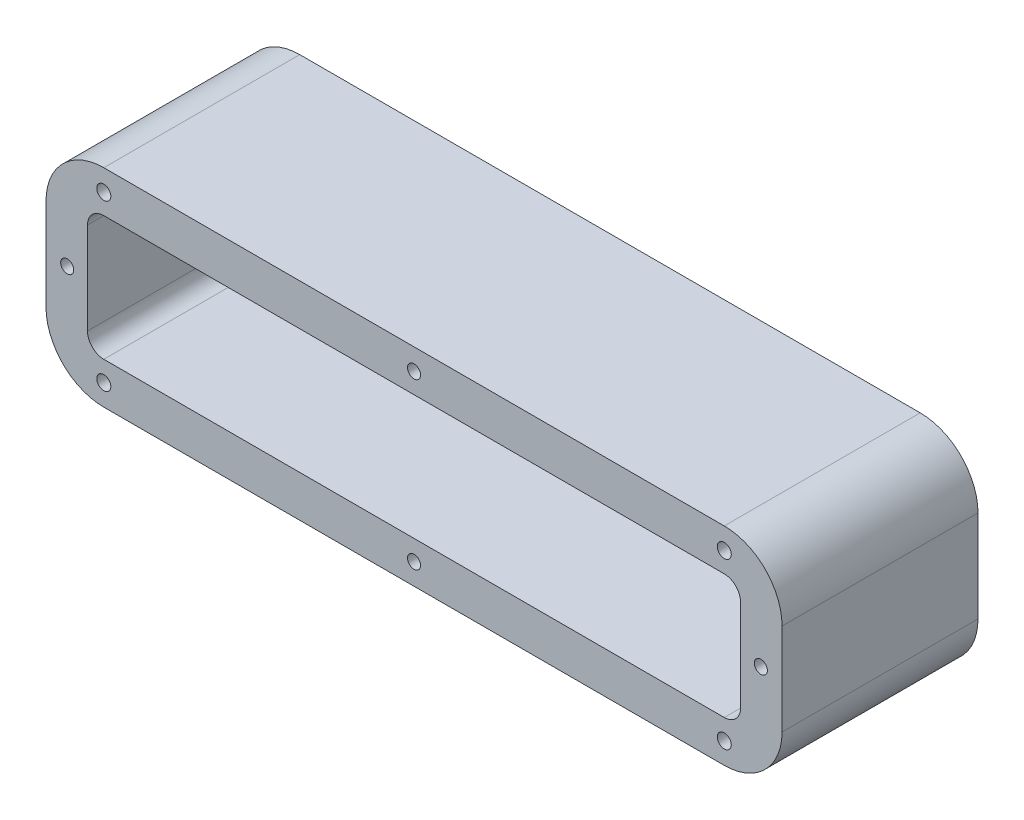
ISO-10303-21;
HEADER;
FILE_DESCRIPTION(('STEP AP214'),'2;1');
FILE_NAME('part.step','',(''),(''),'','','');
FILE_SCHEMA(('AUTOMOTIVE_DESIGN { 1 0 10303 214 1 1 1 1 }'));
ENDSEC;
DATA;
#1=APPLICATION_CONTEXT('core data for automotive mechanical design processes');
#2=APPLICATION_PROTOCOL_DEFINITION('international standard','automotive_design',2000,#1);
#3=PRODUCT_CONTEXT('',#1,'mechanical');
#4=PRODUCT('Part','Part','',(#3));
#5=PRODUCT_RELATED_PRODUCT_CATEGORY('part','',(#4));
#6=PRODUCT_DEFINITION_FORMATION('','',#4);
#7=PRODUCT_DEFINITION_CONTEXT('part definition',#1,'design');
#8=PRODUCT_DEFINITION('design','',#6,#7);
#9=PRODUCT_DEFINITION_SHAPE('','',#8);
#10=(LENGTH_UNIT() NAMED_UNIT(*) SI_UNIT(.MILLI.,.METRE.));
#11=(NAMED_UNIT(*) PLANE_ANGLE_UNIT() SI_UNIT($,.RADIAN.));
#12=(NAMED_UNIT(*) SI_UNIT($,.STERADIAN.) SOLID_ANGLE_UNIT());
#13=UNCERTAINTY_MEASURE_WITH_UNIT(LENGTH_MEASURE(1.E-05),#10,'distance_accuracy_value','');
#14=(GEOMETRIC_REPRESENTATION_CONTEXT(3) GLOBAL_UNCERTAINTY_ASSIGNED_CONTEXT((#13)) GLOBAL_UNIT_ASSIGNED_CONTEXT((#10,
#11,#12)) REPRESENTATION_CONTEXT('',''));
#15=CARTESIAN_POINT('',(0.,0.,0.));
#16=DIRECTION('',(0.,0.,1.));
#17=DIRECTION('',(1.,0.,0.));
#18=AXIS2_PLACEMENT_3D('',#15,#16,#17);
#19=CARTESIAN_POINT('',(95.,14.05,60.));
#20=DIRECTION('',(0.,0.,-1.));
#21=DIRECTION('',(-1.,0.,0.));
#22=AXIS2_PLACEMENT_3D('',#19,#20,#21);
#23=PLANE('',#22);
#24=CARTESIAN_POINT('',(95.,14.05,60.));
#25=DIRECTION('',(0.,0.,1.));
#26=DIRECTION('',(-1.,0.,0.));
#27=AXIS2_PLACEMENT_3D('',#24,#25,#26);
#28=CIRCLE('',#27,17.7);
#29=CARTESIAN_POINT('',(112.7,14.0499999999999,60.));
#30=VERTEX_POINT('',#29);
#31=CARTESIAN_POINT('',(94.9999999999999,31.75,60.));
#32=VERTEX_POINT('',#31);
#33=EDGE_CURVE('E218',#30,#32,#28,.T.);
#34=ORIENTED_EDGE('',*,*,#33,.T.);
#35=DIRECTION('',(-1.,0.,0.));
#36=VECTOR('',#35,1.);
#37=CARTESIAN_POINT('',(-94.9999999999999,31.75,60.));
#38=LINE('',#37,#36);
#39=CARTESIAN_POINT('',(-94.9999999999999,31.75,60.));
#40=VERTEX_POINT('',#39);
#41=EDGE_CURVE('E221',#32,#40,#38,.T.);
#42=ORIENTED_EDGE('',*,*,#41,.T.);
#43=CARTESIAN_POINT('',(-95.,14.05,60.));
#44=DIRECTION('',(0.,0.,1.));
#45=DIRECTION('',(-1.,0.,0.));
#46=AXIS2_PLACEMENT_3D('',#43,#44,#45);
#47=CIRCLE('',#46,17.7);
#48=CARTESIAN_POINT('',(-112.7,14.0499999999999,60.));
#49=VERTEX_POINT('',#48);
#50=EDGE_CURVE('E224',#40,#49,#47,.T.);
#51=ORIENTED_EDGE('',*,*,#50,.T.);
#52=DIRECTION('',(0.,-1.,0.));
#53=VECTOR('',#52,1.);
#54=CARTESIAN_POINT('',(-112.7,-14.0499999999999,60.));
#55=LINE('',#54,#53);
#56=CARTESIAN_POINT('',(-112.7,-14.0499999999999,60.));
#57=VERTEX_POINT('',#56);
#58=EDGE_CURVE('E226',#49,#57,#55,.T.);
#59=ORIENTED_EDGE('',*,*,#58,.T.);
#60=CARTESIAN_POINT('',(-95.,-14.05,60.));
#61=DIRECTION('',(0.,0.,1.));
#62=DIRECTION('',(-1.,0.,0.));
#63=AXIS2_PLACEMENT_3D('',#60,#61,#62);
#64=CIRCLE('',#63,17.7);
#65=CARTESIAN_POINT('',(-94.9999999999999,-31.75,60.));
#66=VERTEX_POINT('',#65);
#67=EDGE_CURVE('E228',#57,#66,#64,.T.);
#68=ORIENTED_EDGE('',*,*,#67,.T.);
#69=DIRECTION('',(1.,0.,0.));
#70=VECTOR('',#69,1.);
#71=CARTESIAN_POINT('',(-94.9999999999999,-31.75,60.));
#72=LINE('',#71,#70);
#73=CARTESIAN_POINT('',(94.9999999999999,-31.75,60.));
#74=VERTEX_POINT('',#73);
#75=EDGE_CURVE('E230',#66,#74,#72,.T.);
#76=ORIENTED_EDGE('',*,*,#75,.T.);
#77=CARTESIAN_POINT('',(95.,-14.05,60.));
#78=DIRECTION('',(0.,0.,1.));
#79=DIRECTION('',(1.,0.,0.));
#80=AXIS2_PLACEMENT_3D('',#77,#78,#79);
#81=CIRCLE('',#80,17.7);
#82=CARTESIAN_POINT('',(112.7,-14.05,60.));
#83=VERTEX_POINT('',#82);
#84=EDGE_CURVE('E232',#74,#83,#81,.T.);
#85=ORIENTED_EDGE('',*,*,#84,.T.);
#86=DIRECTION('',(0.,1.,0.));
#87=VECTOR('',#86,1.);
#88=CARTESIAN_POINT('',(112.7,-14.0499999999999,60.));
#89=LINE('',#88,#87);
#90=EDGE_CURVE('E234',#83,#30,#89,.T.);
#91=ORIENTED_EDGE('',*,*,#90,.T.);
#92=EDGE_LOOP('',(#34,#42,#51,#59,#68,#76,#85,#91));
#93=FACE_BOUND('',#92,.T.);
#94=CARTESIAN_POINT('',(95.0000000000001,14.05,60.));
#95=DIRECTION('',(0.,0.,1.));
#96=DIRECTION('',(-1.,0.,0.));
#97=AXIS2_PLACEMENT_3D('',#94,#95,#96);
#98=CIRCLE('',#97,5.);
#99=CARTESIAN_POINT('',(100.,14.05,60.));
#100=VERTEX_POINT('',#99);
#101=CARTESIAN_POINT('',(95.,19.05,60.));
#102=VERTEX_POINT('',#101);
#103=EDGE_CURVE('E150',#100,#102,#98,.T.);
#104=ORIENTED_EDGE('',*,*,#103,.F.);
#105=DIRECTION('',(0.,1.,0.));
#106=VECTOR('',#105,1.);
#107=CARTESIAN_POINT('',(100.,-14.05,60.));
#108=LINE('',#107,#106);
#109=CARTESIAN_POINT('',(100.,-14.05,60.));
#110=VERTEX_POINT('',#109);
#111=EDGE_CURVE('E185',#110,#100,#108,.T.);
#112=ORIENTED_EDGE('',*,*,#111,.F.);
#113=CARTESIAN_POINT('',(95.0000000000001,-14.05,60.));
#114=DIRECTION('',(0.,0.,1.));
#115=DIRECTION('',(1.,0.,0.));
#116=AXIS2_PLACEMENT_3D('',#113,#114,#115);
#117=CIRCLE('',#116,5.);
#118=CARTESIAN_POINT('',(95.,-19.05,60.));
#119=VERTEX_POINT('',#118);
#120=EDGE_CURVE('E183',#119,#110,#117,.T.);
#121=ORIENTED_EDGE('',*,*,#120,.F.);
#122=DIRECTION('',(1.,0.,0.));
#123=VECTOR('',#122,1.);
#124=CARTESIAN_POINT('',(-94.9999999999999,-19.05,60.));
#125=LINE('',#124,#123);
#126=CARTESIAN_POINT('',(-94.9999999999999,-19.05,60.));
#127=VERTEX_POINT('',#126);
#128=EDGE_CURVE('E181',#127,#119,#125,.T.);
#129=ORIENTED_EDGE('',*,*,#128,.F.);
#130=CARTESIAN_POINT('',(-94.9999999999999,-14.05,60.));
#131=DIRECTION('',(0.,0.,1.));
#132=DIRECTION('',(-1.,0.,0.));
#133=AXIS2_PLACEMENT_3D('',#130,#131,#132);
#134=CIRCLE('',#133,5.);
#135=CARTESIAN_POINT('',(-99.9999999999999,-14.05,60.));
#136=VERTEX_POINT('',#135);
#137=EDGE_CURVE('E179',#136,#127,#134,.T.);
#138=ORIENTED_EDGE('',*,*,#137,.F.);
#139=DIRECTION('',(0.,-1.,0.));
#140=VECTOR('',#139,1.);
#141=CARTESIAN_POINT('',(-99.9999999999999,-14.05,60.));
#142=LINE('',#141,#140);
#143=CARTESIAN_POINT('',(-99.9999999999999,14.05,60.));
#144=VERTEX_POINT('',#143);
#145=EDGE_CURVE('E174',#144,#136,#142,.T.);
#146=ORIENTED_EDGE('',*,*,#145,.F.);
#147=CARTESIAN_POINT('',(-94.9999999999999,14.05,60.));
#148=DIRECTION('',(0.,0.,1.));
#149=DIRECTION('',(-1.,0.,0.));
#150=AXIS2_PLACEMENT_3D('',#147,#148,#149);
#151=CIRCLE('',#150,5.);
#152=CARTESIAN_POINT('',(-94.9999999999999,19.05,60.));
#153=VERTEX_POINT('',#152);
#154=EDGE_CURVE('E172',#153,#144,#151,.T.);
#155=ORIENTED_EDGE('',*,*,#154,.F.);
#156=DIRECTION('',(-1.,0.,0.));
#157=VECTOR('',#156,1.);
#158=CARTESIAN_POINT('',(-94.9999999999999,19.05,60.));
#159=LINE('',#158,#157);
#160=EDGE_CURVE('E158',#102,#153,#159,.T.);
#161=ORIENTED_EDGE('',*,*,#160,.F.);
#162=EDGE_LOOP('',(#104,#112,#121,#129,#138,#146,#155,#161));
#163=FACE_BOUND('',#162,.T.);
#164=CARTESIAN_POINT('',(-106.2,0.,60.));
#165=DIRECTION('',(0.,0.,1.));
#166=DIRECTION('',(1.,0.,0.));
#167=AXIS2_PLACEMENT_3D('',#164,#165,#166);
#168=CIRCLE('',#167,2.);
#169=CARTESIAN_POINT('',(-104.2,0.,60.));
#170=VERTEX_POINT('',#169);
#171=EDGE_CURVE('E188',#170,#170,#168,.T.);
#172=ORIENTED_EDGE('',*,*,#171,.F.);
#173=EDGE_LOOP('',(#172));
#174=FACE_BOUND('',#173,.T.);
#175=CARTESIAN_POINT('',(0.,25.25,60.));
#176=DIRECTION('',(0.,0.,1.));
#177=DIRECTION('',(1.,0.,0.));
#178=AXIS2_PLACEMENT_3D('',#175,#176,#177);
#179=CIRCLE('',#178,2.);
#180=CARTESIAN_POINT('',(1.99999999999994,25.25,60.));
#181=VERTEX_POINT('',#180);
#182=EDGE_CURVE('E436',#181,#181,#179,.T.);
#183=ORIENTED_EDGE('',*,*,#182,.F.);
#184=EDGE_LOOP('',(#183));
#185=FACE_BOUND('',#184,.T.);
#186=CARTESIAN_POINT('',(-95.0000000000001,25.25,60.));
#187=DIRECTION('',(0.,0.,1.));
#188=DIRECTION('',(1.,0.,0.));
#189=AXIS2_PLACEMENT_3D('',#186,#187,#188);
#190=CIRCLE('',#189,2.14689788647293);
#191=CARTESIAN_POINT('',(-92.8531021135271,25.25,60.));
#192=VERTEX_POINT('',#191);
#193=EDGE_CURVE('E430',#192,#192,#190,.T.);
#194=ORIENTED_EDGE('',*,*,#193,.F.);
#195=EDGE_LOOP('',(#194));
#196=FACE_BOUND('',#195,.T.);
#197=CARTESIAN_POINT('',(-95.0000000000001,-25.25,60.));
#198=DIRECTION('',(0.,0.,1.));
#199=DIRECTION('',(-1.,0.,0.));
#200=AXIS2_PLACEMENT_3D('',#197,#198,#199);
#201=CIRCLE('',#200,2.14689788647293);
#202=CARTESIAN_POINT('',(-97.146897886473,-25.25,60.));
#203=VERTEX_POINT('',#202);
#204=EDGE_CURVE('E424',#203,#203,#201,.T.);
#205=ORIENTED_EDGE('',*,*,#204,.F.);
#206=EDGE_LOOP('',(#205));
#207=FACE_BOUND('',#206,.T.);
#208=CARTESIAN_POINT('',(0.,-25.25,60.));
#209=DIRECTION('',(0.,0.,1.));
#210=DIRECTION('',(-1.,0.,0.));
#211=AXIS2_PLACEMENT_3D('',#208,#209,#210);
#212=CIRCLE('',#211,2.);
#213=CARTESIAN_POINT('',(-2.00000000000007,-25.25,60.));
#214=VERTEX_POINT('',#213);
#215=EDGE_CURVE('E418',#214,#214,#212,.T.);
#216=ORIENTED_EDGE('',*,*,#215,.F.);
#217=EDGE_LOOP('',(#216));
#218=FACE_BOUND('',#217,.T.);
#219=CARTESIAN_POINT('',(94.9999999999999,-25.2500000000001,60.));
#220=DIRECTION('',(0.,0.,1.));
#221=DIRECTION('',(1.,0.,0.));
#222=AXIS2_PLACEMENT_3D('',#219,#220,#221);
#223=CIRCLE('',#222,2.14689788647293);
#224=CARTESIAN_POINT('',(97.1468978864728,-25.2500000000001,60.));
#225=VERTEX_POINT('',#224);
#226=EDGE_CURVE('E412',#225,#225,#223,.T.);
#227=ORIENTED_EDGE('',*,*,#226,.F.);
#228=EDGE_LOOP('',(#227));
#229=FACE_BOUND('',#228,.T.);
#230=CARTESIAN_POINT('',(106.2,0.,60.));
#231=DIRECTION('',(0.,0.,1.));
#232=DIRECTION('',(-1.,0.,0.));
#233=AXIS2_PLACEMENT_3D('',#230,#231,#232);
#234=CIRCLE('',#233,2.);
#235=CARTESIAN_POINT('',(104.2,0.,60.));
#236=VERTEX_POINT('',#235);
#237=EDGE_CURVE('E406',#236,#236,#234,.T.);
#238=ORIENTED_EDGE('',*,*,#237,.F.);
#239=EDGE_LOOP('',(#238));
#240=FACE_BOUND('',#239,.T.);
#241=CARTESIAN_POINT('',(95.,25.2499999999999,60.));
#242=DIRECTION('',(0.,0.,1.));
#243=DIRECTION('',(-1.,0.,0.));
#244=AXIS2_PLACEMENT_3D('',#241,#242,#243);
#245=CIRCLE('',#244,2.14689788647293);
#246=CARTESIAN_POINT('',(92.853102113527,25.2499999999999,60.));
#247=VERTEX_POINT('',#246);
#248=EDGE_CURVE('E397',#247,#247,#245,.T.);
#249=ORIENTED_EDGE('',*,*,#248,.F.);
#250=EDGE_LOOP('',(#249));
#251=FACE_BOUND('',#250,.T.);
#252=ADVANCED_FACE('F37',(#93,#163,#174,#185,#196,#207,#218,#229,#240,#251),#23,.F.);
#253=CARTESIAN_POINT('',(95.,14.05,0.));
#254=DIRECTION('',(0.,0.,-1.));
#255=DIRECTION('',(-1.,0.,0.));
#256=AXIS2_PLACEMENT_3D('',#253,#254,#255);
#257=PLANE('',#256);
#258=CARTESIAN_POINT('',(106.2,0.,0.));
#259=DIRECTION('',(0.,0.,1.));
#260=DIRECTION('',(-1.,0.,0.));
#261=AXIS2_PLACEMENT_3D('',#258,#259,#260);
#262=CIRCLE('',#261,2.);
#263=CARTESIAN_POINT('',(104.2,0.,0.));
#264=VERTEX_POINT('',#263);
#265=EDGE_CURVE('E403',#264,#264,#262,.T.);
#266=ORIENTED_EDGE('',*,*,#265,.T.);
#267=EDGE_LOOP('',(#266));
#268=FACE_BOUND('',#267,.T.);
#269=CARTESIAN_POINT('',(0.,-25.25,0.));
#270=DIRECTION('',(0.,0.,1.));
#271=DIRECTION('',(-1.,0.,0.));
#272=AXIS2_PLACEMENT_3D('',#269,#270,#271);
#273=CIRCLE('',#272,2.);
#274=CARTESIAN_POINT('',(-2.00000000000007,-25.25,0.));
#275=VERTEX_POINT('',#274);
#276=EDGE_CURVE('E415',#275,#275,#273,.T.);
#277=ORIENTED_EDGE('',*,*,#276,.T.);
#278=EDGE_LOOP('',(#277));
#279=FACE_BOUND('',#278,.T.);
#280=CARTESIAN_POINT('',(-95.0000000000001,25.25,0.));
#281=DIRECTION('',(0.,0.,1.));
#282=DIRECTION('',(1.,0.,0.));
#283=AXIS2_PLACEMENT_3D('',#280,#281,#282);
#284=CIRCLE('',#283,2.14689788647293);
#285=CARTESIAN_POINT('',(-92.8531021135271,25.25,0.));
#286=VERTEX_POINT('',#285);
#287=EDGE_CURVE('E427',#286,#286,#284,.T.);
#288=ORIENTED_EDGE('',*,*,#287,.T.);
#289=EDGE_LOOP('',(#288));
#290=FACE_BOUND('',#289,.T.);
#291=CARTESIAN_POINT('',(-106.2,0.,0.));
#292=DIRECTION('',(0.,0.,1.));
#293=DIRECTION('',(1.,0.,0.));
#294=AXIS2_PLACEMENT_3D('',#291,#292,#293);
#295=CIRCLE('',#294,2.);
#296=CARTESIAN_POINT('',(-104.2,0.,0.));
#297=VERTEX_POINT('',#296);
#298=EDGE_CURVE('E439',#297,#297,#295,.T.);
#299=ORIENTED_EDGE('',*,*,#298,.T.);
#300=EDGE_LOOP('',(#299));
#301=FACE_BOUND('',#300,.T.);
#302=CARTESIAN_POINT('',(95.,14.05,0.));
#303=DIRECTION('',(0.,0.,1.));
#304=DIRECTION('',(-1.,0.,0.));
#305=AXIS2_PLACEMENT_3D('',#302,#303,#304);
#306=CIRCLE('',#305,17.7);
#307=CARTESIAN_POINT('',(112.7,14.0499999999999,0.));
#308=VERTEX_POINT('',#307);
#309=CARTESIAN_POINT('',(94.9999999999999,31.75,0.));
#310=VERTEX_POINT('',#309);
#311=EDGE_CURVE('E166',#308,#310,#306,.T.);
#312=ORIENTED_EDGE('',*,*,#311,.F.);
#313=DIRECTION('',(0.,1.,0.));
#314=VECTOR('',#313,1.);
#315=CARTESIAN_POINT('',(112.7,-14.0499999999999,0.));
#316=LINE('',#315,#314);
#317=CARTESIAN_POINT('',(112.7,-14.05,0.));
#318=VERTEX_POINT('',#317);
#319=EDGE_CURVE('E222',#318,#308,#316,.T.);
#320=ORIENTED_EDGE('',*,*,#319,.F.);
#321=CARTESIAN_POINT('',(95.,-14.05,0.));
#322=DIRECTION('',(0.,0.,1.));
#323=DIRECTION('',(1.,0.,0.));
#324=AXIS2_PLACEMENT_3D('',#321,#322,#323);
#325=CIRCLE('',#324,17.7);
#326=CARTESIAN_POINT('',(94.9999999999999,-31.75,0.));
#327=VERTEX_POINT('',#326);
#328=EDGE_CURVE('E249',#327,#318,#325,.T.);
#329=ORIENTED_EDGE('',*,*,#328,.F.);
#330=DIRECTION('',(1.,0.,0.));
#331=VECTOR('',#330,1.);
#332=CARTESIAN_POINT('',(-94.9999999999999,-31.75,0.));
#333=LINE('',#332,#331);
#334=CARTESIAN_POINT('',(-94.9999999999999,-31.75,0.));
#335=VERTEX_POINT('',#334);
#336=EDGE_CURVE('E247',#335,#327,#333,.T.);
#337=ORIENTED_EDGE('',*,*,#336,.F.);
#338=CARTESIAN_POINT('',(-95.,-14.05,0.));
#339=DIRECTION('',(0.,0.,1.));
#340=DIRECTION('',(-1.,0.,0.));
#341=AXIS2_PLACEMENT_3D('',#338,#339,#340);
#342=CIRCLE('',#341,17.7);
#343=CARTESIAN_POINT('',(-112.7,-14.0499999999999,0.));
#344=VERTEX_POINT('',#343);
#345=EDGE_CURVE('E245',#344,#335,#342,.T.);
#346=ORIENTED_EDGE('',*,*,#345,.F.);
#347=DIRECTION('',(0.,-1.,0.));
#348=VECTOR('',#347,1.);
#349=CARTESIAN_POINT('',(-112.7,-14.0499999999999,0.));
#350=LINE('',#349,#348);
#351=CARTESIAN_POINT('',(-112.7,14.0499999999999,0.));
#352=VERTEX_POINT('',#351);
#353=EDGE_CURVE('E243',#352,#344,#350,.T.);
#354=ORIENTED_EDGE('',*,*,#353,.F.);
#355=CARTESIAN_POINT('',(-95.,14.05,0.));
#356=DIRECTION('',(0.,0.,1.));
#357=DIRECTION('',(-1.,0.,0.));
#358=AXIS2_PLACEMENT_3D('',#355,#356,#357);
#359=CIRCLE('',#358,17.7);
#360=CARTESIAN_POINT('',(-94.9999999999999,31.75,0.));
#361=VERTEX_POINT('',#360);
#362=EDGE_CURVE('E241',#361,#352,#359,.T.);
#363=ORIENTED_EDGE('',*,*,#362,.F.);
#364=DIRECTION('',(-1.,0.,0.));
#365=VECTOR('',#364,1.);
#366=CARTESIAN_POINT('',(-94.9999999999999,31.75,0.));
#367=LINE('',#366,#365);
#368=EDGE_CURVE('E239',#310,#361,#367,.T.);
#369=ORIENTED_EDGE('',*,*,#368,.F.);
#370=EDGE_LOOP('',(#312,#320,#329,#337,#346,#354,#363,#369));
#371=FACE_BOUND('',#370,.T.);
#372=DIRECTION('',(0.,1.,0.));
#373=VECTOR('',#372,1.);
#374=CARTESIAN_POINT('',(100.,-14.05,0.));
#375=LINE('',#374,#373);
#376=CARTESIAN_POINT('',(100.,-14.05,0.));
#377=VERTEX_POINT('',#376);
#378=CARTESIAN_POINT('',(100.,14.05,0.));
#379=VERTEX_POINT('',#378);
#380=EDGE_CURVE('E159',#377,#379,#375,.T.);
#381=ORIENTED_EDGE('',*,*,#380,.T.);
#382=CARTESIAN_POINT('',(95.0000000000001,14.05,0.));
#383=DIRECTION('',(0.,0.,1.));
#384=DIRECTION('',(-1.,0.,0.));
#385=AXIS2_PLACEMENT_3D('',#382,#383,#384);
#386=CIRCLE('',#385,5.);
#387=CARTESIAN_POINT('',(95.,19.05,0.));
#388=VERTEX_POINT('',#387);
#389=EDGE_CURVE('E60',#379,#388,#386,.T.);
#390=ORIENTED_EDGE('',*,*,#389,.T.);
#391=DIRECTION('',(-1.,0.,0.));
#392=VECTOR('',#391,1.);
#393=CARTESIAN_POINT('',(-94.9999999999999,19.05,0.));
#394=LINE('',#393,#392);
#395=CARTESIAN_POINT('',(-94.9999999999999,19.05,0.));
#396=VERTEX_POINT('',#395);
#397=EDGE_CURVE('E165',#388,#396,#394,.T.);
#398=ORIENTED_EDGE('',*,*,#397,.T.);
#399=CARTESIAN_POINT('',(-94.9999999999999,14.05,0.));
#400=DIRECTION('',(0.,0.,1.));
#401=DIRECTION('',(-1.,0.,0.));
#402=AXIS2_PLACEMENT_3D('',#399,#400,#401);
#403=CIRCLE('',#402,5.);
#404=CARTESIAN_POINT('',(-99.9999999999999,14.05,0.));
#405=VERTEX_POINT('',#404);
#406=EDGE_CURVE('E190',#396,#405,#403,.T.);
#407=ORIENTED_EDGE('',*,*,#406,.T.);
#408=DIRECTION('',(0.,-1.,0.));
#409=VECTOR('',#408,1.);
#410=CARTESIAN_POINT('',(-99.9999999999999,-14.05,0.));
#411=LINE('',#410,#409);
#412=CARTESIAN_POINT('',(-99.9999999999999,-14.05,0.));
#413=VERTEX_POINT('',#412);
#414=EDGE_CURVE('E193',#405,#413,#411,.T.);
#415=ORIENTED_EDGE('',*,*,#414,.T.);
#416=CARTESIAN_POINT('',(-94.9999999999999,-14.05,0.));
#417=DIRECTION('',(0.,0.,1.));
#418=DIRECTION('',(-1.,0.,0.));
#419=AXIS2_PLACEMENT_3D('',#416,#417,#418);
#420=CIRCLE('',#419,5.);
#421=CARTESIAN_POINT('',(-94.9999999999999,-19.05,0.));
#422=VERTEX_POINT('',#421);
#423=EDGE_CURVE('E196',#413,#422,#420,.T.);
#424=ORIENTED_EDGE('',*,*,#423,.T.);
#425=DIRECTION('',(1.,0.,0.));
#426=VECTOR('',#425,1.);
#427=CARTESIAN_POINT('',(-94.9999999999999,-19.05,0.));
#428=LINE('',#427,#426);
#429=CARTESIAN_POINT('',(95.,-19.05,0.));
#430=VERTEX_POINT('',#429);
#431=EDGE_CURVE('E199',#422,#430,#428,.T.);
#432=ORIENTED_EDGE('',*,*,#431,.T.);
#433=CARTESIAN_POINT('',(95.0000000000001,-14.05,0.));
#434=DIRECTION('',(0.,0.,1.));
#435=DIRECTION('',(1.,0.,0.));
#436=AXIS2_PLACEMENT_3D('',#433,#434,#435);
#437=CIRCLE('',#436,5.);
#438=EDGE_CURVE('E202',#430,#377,#437,.T.);
#439=ORIENTED_EDGE('',*,*,#438,.T.);
#440=EDGE_LOOP('',(#381,#390,#398,#407,#415,#424,#432,#439));
#441=FACE_BOUND('',#440,.T.);
#442=CARTESIAN_POINT('',(0.,25.25,0.));
#443=DIRECTION('',(0.,0.,1.));
#444=DIRECTION('',(1.,0.,0.));
#445=AXIS2_PLACEMENT_3D('',#442,#443,#444);
#446=CIRCLE('',#445,2.);
#447=CARTESIAN_POINT('',(1.99999999999994,25.25,0.));
#448=VERTEX_POINT('',#447);
#449=EDGE_CURVE('E433',#448,#448,#446,.T.);
#450=ORIENTED_EDGE('',*,*,#449,.T.);
#451=EDGE_LOOP('',(#450));
#452=FACE_BOUND('',#451,.T.);
#453=CARTESIAN_POINT('',(-95.0000000000001,-25.25,0.));
#454=DIRECTION('',(0.,0.,1.));
#455=DIRECTION('',(-1.,0.,0.));
#456=AXIS2_PLACEMENT_3D('',#453,#454,#455);
#457=CIRCLE('',#456,2.14689788647293);
#458=CARTESIAN_POINT('',(-97.146897886473,-25.25,0.));
#459=VERTEX_POINT('',#458);
#460=EDGE_CURVE('E421',#459,#459,#457,.T.);
#461=ORIENTED_EDGE('',*,*,#460,.T.);
#462=EDGE_LOOP('',(#461));
#463=FACE_BOUND('',#462,.T.);
#464=CARTESIAN_POINT('',(94.9999999999999,-25.2500000000001,0.));
#465=DIRECTION('',(0.,0.,1.));
#466=DIRECTION('',(1.,0.,0.));
#467=AXIS2_PLACEMENT_3D('',#464,#465,#466);
#468=CIRCLE('',#467,2.14689788647293);
#469=CARTESIAN_POINT('',(97.1468978864728,-25.2500000000001,0.));
#470=VERTEX_POINT('',#469);
#471=EDGE_CURVE('E409',#470,#470,#468,.T.);
#472=ORIENTED_EDGE('',*,*,#471,.T.);
#473=EDGE_LOOP('',(#472));
#474=FACE_BOUND('',#473,.T.);
#475=CARTESIAN_POINT('',(95.,25.2499999999999,0.));
#476=DIRECTION('',(0.,0.,1.));
#477=DIRECTION('',(-1.,0.,0.));
#478=AXIS2_PLACEMENT_3D('',#475,#476,#477);
#479=CIRCLE('',#478,2.14689788647293);
#480=CARTESIAN_POINT('',(92.853102113527,25.2499999999999,0.));
#481=VERTEX_POINT('',#480);
#482=EDGE_CURVE('E400',#481,#481,#479,.T.);
#483=ORIENTED_EDGE('',*,*,#482,.T.);
#484=EDGE_LOOP('',(#483));
#485=FACE_BOUND('',#484,.T.);
#486=ADVANCED_FACE('F279',(#268,#279,#290,#301,#371,#441,#452,#463,#474,#485),#257,.T.);
#487=CARTESIAN_POINT('',(95.,14.05,60.));
#488=DIRECTION('',(0.,0.,-1.));
#489=DIRECTION('',(-1.,0.,0.));
#490=AXIS2_PLACEMENT_3D('',#487,#488,#489);
#491=CYLINDRICAL_SURFACE('',#490,17.7);
#492=ORIENTED_EDGE('',*,*,#311,.T.);
#493=DIRECTION('',(0.,0.,-1.));
#494=VECTOR('',#493,1.);
#495=CARTESIAN_POINT('',(94.9999999999999,31.75,60.));
#496=LINE('',#495,#494);
#497=EDGE_CURVE('E11',#32,#310,#496,.T.);
#498=ORIENTED_EDGE('',*,*,#497,.F.);
#499=ORIENTED_EDGE('',*,*,#33,.F.);
#500=DIRECTION('',(0.,0.,-1.));
#501=VECTOR('',#500,1.);
#502=CARTESIAN_POINT('',(112.7,14.0499999999999,60.));
#503=LINE('',#502,#501);
#504=EDGE_CURVE('E236',#30,#308,#503,.T.);
#505=ORIENTED_EDGE('',*,*,#504,.T.);
#506=EDGE_LOOP('',(#492,#498,#499,#505));
#507=FACE_BOUND('',#506,.T.);
#508=ADVANCED_FACE('F39',(#507),#491,.T.);
#509=CARTESIAN_POINT('',(-94.9999999999999,31.75,60.));
#510=DIRECTION('',(0.,-1.,0.));
#511=DIRECTION('',(0.,0.,-1.));
#512=AXIS2_PLACEMENT_3D('',#509,#510,#511);
#513=PLANE('',#512);
#514=ORIENTED_EDGE('',*,*,#368,.T.);
#515=DIRECTION('',(0.,0.,-1.));
#516=VECTOR('',#515,1.);
#517=CARTESIAN_POINT('',(-94.9999999999999,31.75,60.));
#518=LINE('',#517,#516);
#519=EDGE_CURVE('E45',#40,#361,#518,.T.);
#520=ORIENTED_EDGE('',*,*,#519,.F.);
#521=ORIENTED_EDGE('',*,*,#41,.F.);
#522=ORIENTED_EDGE('',*,*,#497,.T.);
#523=EDGE_LOOP('',(#514,#520,#521,#522));
#524=FACE_BOUND('',#523,.T.);
#525=ADVANCED_FACE('F296',(#524),#513,.F.);
#526=CARTESIAN_POINT('',(-95.,14.05,60.));
#527=DIRECTION('',(0.,0.,-1.));
#528=DIRECTION('',(-1.,0.,0.));
#529=AXIS2_PLACEMENT_3D('',#526,#527,#528);
#530=CYLINDRICAL_SURFACE('',#529,17.7);
#531=ORIENTED_EDGE('',*,*,#362,.T.);
#532=DIRECTION('',(0.,0.,-1.));
#533=VECTOR('',#532,1.);
#534=CARTESIAN_POINT('',(-112.7,14.0499999999999,60.));
#535=LINE('',#534,#533);
#536=EDGE_CURVE('E266',#49,#352,#535,.T.);
#537=ORIENTED_EDGE('',*,*,#536,.F.);
#538=ORIENTED_EDGE('',*,*,#50,.F.);
#539=ORIENTED_EDGE('',*,*,#519,.T.);
#540=EDGE_LOOP('',(#531,#537,#538,#539));
#541=FACE_BOUND('',#540,.T.);
#542=ADVANCED_FACE('F273',(#541),#530,.T.);
#543=CARTESIAN_POINT('',(-112.7,-14.0499999999999,60.));
#544=DIRECTION('',(1.,0.,0.));
#545=DIRECTION('',(0.,0.,-1.));
#546=AXIS2_PLACEMENT_3D('',#543,#544,#545);
#547=PLANE('',#546);
#548=ORIENTED_EDGE('',*,*,#353,.T.);
#549=DIRECTION('',(0.,0.,-1.));
#550=VECTOR('',#549,1.);
#551=CARTESIAN_POINT('',(-112.7,-14.0499999999999,60.));
#552=LINE('',#551,#550);
#553=EDGE_CURVE('E263',#57,#344,#552,.T.);
#554=ORIENTED_EDGE('',*,*,#553,.F.);
#555=ORIENTED_EDGE('',*,*,#58,.F.);
#556=ORIENTED_EDGE('',*,*,#536,.T.);
#557=EDGE_LOOP('',(#548,#554,#555,#556));
#558=FACE_BOUND('',#557,.T.);
#559=ADVANCED_FACE('F285',(#558),#547,.F.);
#560=CARTESIAN_POINT('',(-95.,-14.05,60.));
#561=DIRECTION('',(0.,0.,-1.));
#562=DIRECTION('',(-1.,0.,0.));
#563=AXIS2_PLACEMENT_3D('',#560,#561,#562);
#564=CYLINDRICAL_SURFACE('',#563,17.7);
#565=ORIENTED_EDGE('',*,*,#345,.T.);
#566=DIRECTION('',(0.,0.,-1.));
#567=VECTOR('',#566,1.);
#568=CARTESIAN_POINT('',(-94.9999999999999,-31.75,60.));
#569=LINE('',#568,#567);
#570=EDGE_CURVE('E260',#66,#335,#569,.T.);
#571=ORIENTED_EDGE('',*,*,#570,.F.);
#572=ORIENTED_EDGE('',*,*,#67,.F.);
#573=ORIENTED_EDGE('',*,*,#553,.T.);
#574=EDGE_LOOP('',(#565,#571,#572,#573));
#575=FACE_BOUND('',#574,.T.);
#576=ADVANCED_FACE('F289',(#575),#564,.T.);
#577=CARTESIAN_POINT('',(-94.9999999999999,-31.75,60.));
#578=DIRECTION('',(0.,1.,0.));
#579=DIRECTION('',(0.,0.,1.));
#580=AXIS2_PLACEMENT_3D('',#577,#578,#579);
#581=PLANE('',#580);
#582=ORIENTED_EDGE('',*,*,#336,.T.);
#583=DIRECTION('',(0.,0.,-1.));
#584=VECTOR('',#583,1.);
#585=CARTESIAN_POINT('',(94.9999999999999,-31.75,60.));
#586=LINE('',#585,#584);
#587=EDGE_CURVE('E257',#74,#327,#586,.T.);
#588=ORIENTED_EDGE('',*,*,#587,.F.);
#589=ORIENTED_EDGE('',*,*,#75,.F.);
#590=ORIENTED_EDGE('',*,*,#570,.T.);
#591=EDGE_LOOP('',(#582,#588,#589,#590));
#592=FACE_BOUND('',#591,.T.);
#593=ADVANCED_FACE('F309',(#592),#581,.F.);
#594=CARTESIAN_POINT('',(95.,-14.05,60.));
#595=DIRECTION('',(0.,0.,-1.));
#596=DIRECTION('',(-1.,0.,0.));
#597=AXIS2_PLACEMENT_3D('',#594,#595,#596);
#598=CYLINDRICAL_SURFACE('',#597,17.7);
#599=ORIENTED_EDGE('',*,*,#328,.T.);
#600=DIRECTION('',(0.,0.,-1.));
#601=VECTOR('',#600,1.);
#602=CARTESIAN_POINT('',(112.7,-14.05,60.));
#603=LINE('',#602,#601);
#604=EDGE_CURVE('E254',#83,#318,#603,.T.);
#605=ORIENTED_EDGE('',*,*,#604,.F.);
#606=ORIENTED_EDGE('',*,*,#84,.F.);
#607=ORIENTED_EDGE('',*,*,#587,.T.);
#608=EDGE_LOOP('',(#599,#605,#606,#607));
#609=FACE_BOUND('',#608,.T.);
#610=ADVANCED_FACE('F307',(#609),#598,.T.);
#611=CARTESIAN_POINT('',(112.7,-14.0499999999999,60.));
#612=DIRECTION('',(-1.,0.,0.));
#613=DIRECTION('',(0.,0.,1.));
#614=AXIS2_PLACEMENT_3D('',#611,#612,#613);
#615=PLANE('',#614);
#616=ORIENTED_EDGE('',*,*,#319,.T.);
#617=ORIENTED_EDGE('',*,*,#504,.F.);
#618=ORIENTED_EDGE('',*,*,#90,.F.);
#619=ORIENTED_EDGE('',*,*,#604,.T.);
#620=EDGE_LOOP('',(#616,#617,#618,#619));
#621=FACE_BOUND('',#620,.T.);
#622=ADVANCED_FACE('F302',(#621),#615,.F.);
#623=CARTESIAN_POINT('',(95.0000000000001,14.05,60.));
#624=DIRECTION('',(0.,0.,-1.));
#625=DIRECTION('',(-1.,0.,0.));
#626=AXIS2_PLACEMENT_3D('',#623,#624,#625);
#627=CYLINDRICAL_SURFACE('',#626,5.);
#628=ORIENTED_EDGE('',*,*,#389,.F.);
#629=DIRECTION('',(0.,0.,-1.));
#630=VECTOR('',#629,1.);
#631=CARTESIAN_POINT('',(100.,14.05,60.));
#632=LINE('',#631,#630);
#633=EDGE_CURVE('E154',#100,#379,#632,.T.);
#634=ORIENTED_EDGE('',*,*,#633,.F.);
#635=ORIENTED_EDGE('',*,*,#103,.T.);
#636=DIRECTION('',(0.,0.,-1.));
#637=VECTOR('',#636,1.);
#638=CARTESIAN_POINT('',(95.,19.05,60.));
#639=LINE('',#638,#637);
#640=EDGE_CURVE('E153',#102,#388,#639,.T.);
#641=ORIENTED_EDGE('',*,*,#640,.T.);
#642=EDGE_LOOP('',(#628,#634,#635,#641));
#643=FACE_BOUND('',#642,.T.);
#644=ADVANCED_FACE('F152',(#643),#627,.F.);
#645=CARTESIAN_POINT('',(-94.9999999999999,19.05,60.));
#646=DIRECTION('',(0.,-1.,0.));
#647=DIRECTION('',(0.,0.,-1.));
#648=AXIS2_PLACEMENT_3D('',#645,#646,#647);
#649=PLANE('',#648);
#650=ORIENTED_EDGE('',*,*,#397,.F.);
#651=ORIENTED_EDGE('',*,*,#640,.F.);
#652=ORIENTED_EDGE('',*,*,#160,.T.);
#653=DIRECTION('',(0.,0.,-1.));
#654=VECTOR('',#653,1.);
#655=CARTESIAN_POINT('',(-94.9999999999999,19.05,60.));
#656=LINE('',#655,#654);
#657=EDGE_CURVE('E167',#153,#396,#656,.T.);
#658=ORIENTED_EDGE('',*,*,#657,.T.);
#659=EDGE_LOOP('',(#650,#651,#652,#658));
#660=FACE_BOUND('',#659,.T.);
#661=ADVANCED_FACE('F162',(#660),#649,.T.);
#662=CARTESIAN_POINT('',(-94.9999999999999,14.05,60.));
#663=DIRECTION('',(0.,0.,-1.));
#664=DIRECTION('',(-1.,0.,0.));
#665=AXIS2_PLACEMENT_3D('',#662,#663,#664);
#666=CYLINDRICAL_SURFACE('',#665,5.);
#667=ORIENTED_EDGE('',*,*,#406,.F.);
#668=ORIENTED_EDGE('',*,*,#657,.F.);
#669=ORIENTED_EDGE('',*,*,#154,.T.);
#670=DIRECTION('',(0.,0.,-1.));
#671=VECTOR('',#670,1.);
#672=CARTESIAN_POINT('',(-99.9999999999999,14.05,60.));
#673=LINE('',#672,#671);
#674=EDGE_CURVE('E215',#144,#405,#673,.T.);
#675=ORIENTED_EDGE('',*,*,#674,.T.);
#676=EDGE_LOOP('',(#667,#668,#669,#675));
#677=FACE_BOUND('',#676,.T.);
#678=ADVANCED_FACE('F335',(#677),#666,.F.);
#679=CARTESIAN_POINT('',(-99.9999999999999,-14.05,60.));
#680=DIRECTION('',(1.,0.,0.));
#681=DIRECTION('',(0.,0.,-1.));
#682=AXIS2_PLACEMENT_3D('',#679,#680,#681);
#683=PLANE('',#682);
#684=ORIENTED_EDGE('',*,*,#414,.F.);
#685=ORIENTED_EDGE('',*,*,#674,.F.);
#686=ORIENTED_EDGE('',*,*,#145,.T.);
#687=DIRECTION('',(0.,0.,-1.));
#688=VECTOR('',#687,1.);
#689=CARTESIAN_POINT('',(-99.9999999999999,-14.05,60.));
#690=LINE('',#689,#688);
#691=EDGE_CURVE('E213',#136,#413,#690,.T.);
#692=ORIENTED_EDGE('',*,*,#691,.T.);
#693=EDGE_LOOP('',(#684,#685,#686,#692));
#694=FACE_BOUND('',#693,.T.);
#695=ADVANCED_FACE('F339',(#694),#683,.T.);
#696=CARTESIAN_POINT('',(-94.9999999999999,-14.05,60.));
#697=DIRECTION('',(0.,0.,-1.));
#698=DIRECTION('',(-1.,0.,0.));
#699=AXIS2_PLACEMENT_3D('',#696,#697,#698);
#700=CYLINDRICAL_SURFACE('',#699,5.);
#701=ORIENTED_EDGE('',*,*,#423,.F.);
#702=ORIENTED_EDGE('',*,*,#691,.F.);
#703=ORIENTED_EDGE('',*,*,#137,.T.);
#704=DIRECTION('',(0.,0.,-1.));
#705=VECTOR('',#704,1.);
#706=CARTESIAN_POINT('',(-94.9999999999999,-19.05,60.));
#707=LINE('',#706,#705);
#708=EDGE_CURVE('E211',#127,#422,#707,.T.);
#709=ORIENTED_EDGE('',*,*,#708,.T.);
#710=EDGE_LOOP('',(#701,#702,#703,#709));
#711=FACE_BOUND('',#710,.T.);
#712=ADVANCED_FACE('F345',(#711),#700,.F.);
#713=CARTESIAN_POINT('',(-94.9999999999999,-19.05,60.));
#714=DIRECTION('',(0.,1.,0.));
#715=DIRECTION('',(0.,0.,1.));
#716=AXIS2_PLACEMENT_3D('',#713,#714,#715);
#717=PLANE('',#716);
#718=ORIENTED_EDGE('',*,*,#431,.F.);
#719=ORIENTED_EDGE('',*,*,#708,.F.);
#720=ORIENTED_EDGE('',*,*,#128,.T.);
#721=DIRECTION('',(0.,0.,-1.));
#722=VECTOR('',#721,1.);
#723=CARTESIAN_POINT('',(95.,-19.05,60.));
#724=LINE('',#723,#722);
#725=EDGE_CURVE('E209',#119,#430,#724,.T.);
#726=ORIENTED_EDGE('',*,*,#725,.T.);
#727=EDGE_LOOP('',(#718,#719,#720,#726));
#728=FACE_BOUND('',#727,.T.);
#729=ADVANCED_FACE('F349',(#728),#717,.T.);
#730=CARTESIAN_POINT('',(95.0000000000001,-14.05,60.));
#731=DIRECTION('',(0.,0.,-1.));
#732=DIRECTION('',(-1.,0.,0.));
#733=AXIS2_PLACEMENT_3D('',#730,#731,#732);
#734=CYLINDRICAL_SURFACE('',#733,5.);
#735=ORIENTED_EDGE('',*,*,#438,.F.);
#736=ORIENTED_EDGE('',*,*,#725,.F.);
#737=ORIENTED_EDGE('',*,*,#120,.T.);
#738=DIRECTION('',(0.,0.,-1.));
#739=VECTOR('',#738,1.);
#740=CARTESIAN_POINT('',(100.,-14.05,60.));
#741=LINE('',#740,#739);
#742=EDGE_CURVE('E52',#110,#377,#741,.T.);
#743=ORIENTED_EDGE('',*,*,#742,.T.);
#744=EDGE_LOOP('',(#735,#736,#737,#743));
#745=FACE_BOUND('',#744,.T.);
#746=ADVANCED_FACE('F353',(#745),#734,.F.);
#747=CARTESIAN_POINT('',(100.,-14.05,60.));
#748=DIRECTION('',(-1.,0.,0.));
#749=DIRECTION('',(0.,0.,1.));
#750=AXIS2_PLACEMENT_3D('',#747,#748,#749);
#751=PLANE('',#750);
#752=ORIENTED_EDGE('',*,*,#380,.F.);
#753=ORIENTED_EDGE('',*,*,#742,.F.);
#754=ORIENTED_EDGE('',*,*,#111,.T.);
#755=ORIENTED_EDGE('',*,*,#633,.T.);
#756=EDGE_LOOP('',(#752,#753,#754,#755));
#757=FACE_BOUND('',#756,.T.);
#758=ADVANCED_FACE('F357',(#757),#751,.T.);
#759=CARTESIAN_POINT('',(-106.2,0.,60.));
#760=DIRECTION('',(0.,0.,-1.));
#761=DIRECTION('',(-1.,0.,0.));
#762=AXIS2_PLACEMENT_3D('',#759,#760,#761);
#763=CYLINDRICAL_SURFACE('',#762,2.);
#764=ORIENTED_EDGE('',*,*,#171,.T.);
#765=EDGE_LOOP('',(#764));
#766=FACE_BOUND('',#765,.T.);
#767=ORIENTED_EDGE('',*,*,#298,.F.);
#768=EDGE_LOOP('',(#767));
#769=FACE_BOUND('',#768,.T.);
#770=ADVANCED_FACE('F361',(#766,#769),#763,.F.);
#771=CARTESIAN_POINT('',(0.,25.25,60.));
#772=DIRECTION('',(0.,0.,-1.));
#773=DIRECTION('',(-1.,0.,0.));
#774=AXIS2_PLACEMENT_3D('',#771,#772,#773);
#775=CYLINDRICAL_SURFACE('',#774,2.);
#776=ORIENTED_EDGE('',*,*,#182,.T.);
#777=EDGE_LOOP('',(#776));
#778=FACE_BOUND('',#777,.T.);
#779=ORIENTED_EDGE('',*,*,#449,.F.);
#780=EDGE_LOOP('',(#779));
#781=FACE_BOUND('',#780,.T.);
#782=ADVANCED_FACE('F364',(#778,#781),#775,.F.);
#783=CARTESIAN_POINT('',(-95.0000000000001,25.25,60.));
#784=DIRECTION('',(0.,0.,-1.));
#785=DIRECTION('',(-1.,0.,0.));
#786=AXIS2_PLACEMENT_3D('',#783,#784,#785);
#787=CYLINDRICAL_SURFACE('',#786,2.14689788647293);
#788=ORIENTED_EDGE('',*,*,#193,.T.);
#789=EDGE_LOOP('',(#788));
#790=FACE_BOUND('',#789,.T.);
#791=ORIENTED_EDGE('',*,*,#287,.F.);
#792=EDGE_LOOP('',(#791));
#793=FACE_BOUND('',#792,.T.);
#794=ADVANCED_FACE('F368',(#790,#793),#787,.F.);
#795=CARTESIAN_POINT('',(-95.0000000000001,-25.25,60.));
#796=DIRECTION('',(0.,0.,-1.));
#797=DIRECTION('',(-1.,0.,0.));
#798=AXIS2_PLACEMENT_3D('',#795,#796,#797);
#799=CYLINDRICAL_SURFACE('',#798,2.14689788647293);
#800=ORIENTED_EDGE('',*,*,#204,.T.);
#801=EDGE_LOOP('',(#800));
#802=FACE_BOUND('',#801,.T.);
#803=ORIENTED_EDGE('',*,*,#460,.F.);
#804=EDGE_LOOP('',(#803));
#805=FACE_BOUND('',#804,.T.);
#806=ADVANCED_FACE('F372',(#802,#805),#799,.F.);
#807=CARTESIAN_POINT('',(0.,-25.25,60.));
#808=DIRECTION('',(0.,0.,-1.));
#809=DIRECTION('',(-1.,0.,0.));
#810=AXIS2_PLACEMENT_3D('',#807,#808,#809);
#811=CYLINDRICAL_SURFACE('',#810,2.);
#812=ORIENTED_EDGE('',*,*,#215,.T.);
#813=EDGE_LOOP('',(#812));
#814=FACE_BOUND('',#813,.T.);
#815=ORIENTED_EDGE('',*,*,#276,.F.);
#816=EDGE_LOOP('',(#815));
#817=FACE_BOUND('',#816,.T.);
#818=ADVANCED_FACE('F376',(#814,#817),#811,.F.);
#819=CARTESIAN_POINT('',(94.9999999999999,-25.2500000000001,60.));
#820=DIRECTION('',(0.,0.,-1.));
#821=DIRECTION('',(-1.,0.,0.));
#822=AXIS2_PLACEMENT_3D('',#819,#820,#821);
#823=CYLINDRICAL_SURFACE('',#822,2.14689788647293);
#824=ORIENTED_EDGE('',*,*,#226,.T.);
#825=EDGE_LOOP('',(#824));
#826=FACE_BOUND('',#825,.T.);
#827=ORIENTED_EDGE('',*,*,#471,.F.);
#828=EDGE_LOOP('',(#827));
#829=FACE_BOUND('',#828,.T.);
#830=ADVANCED_FACE('F380',(#826,#829),#823,.F.);
#831=CARTESIAN_POINT('',(106.2,0.,60.));
#832=DIRECTION('',(0.,0.,-1.));
#833=DIRECTION('',(-1.,0.,0.));
#834=AXIS2_PLACEMENT_3D('',#831,#832,#833);
#835=CYLINDRICAL_SURFACE('',#834,2.);
#836=ORIENTED_EDGE('',*,*,#237,.T.);
#837=EDGE_LOOP('',(#836));
#838=FACE_BOUND('',#837,.T.);
#839=ORIENTED_EDGE('',*,*,#265,.F.);
#840=EDGE_LOOP('',(#839));
#841=FACE_BOUND('',#840,.T.);
#842=ADVANCED_FACE('F384',(#838,#841),#835,.F.);
#843=CARTESIAN_POINT('',(95.,25.2499999999999,60.));
#844=DIRECTION('',(0.,0.,-1.));
#845=DIRECTION('',(-1.,0.,0.));
#846=AXIS2_PLACEMENT_3D('',#843,#844,#845);
#847=CYLINDRICAL_SURFACE('',#846,2.14689788647293);
#848=ORIENTED_EDGE('',*,*,#248,.T.);
#849=EDGE_LOOP('',(#848));
#850=FACE_BOUND('',#849,.T.);
#851=ORIENTED_EDGE('',*,*,#482,.F.);
#852=EDGE_LOOP('',(#851));
#853=FACE_BOUND('',#852,.T.);
#854=ADVANCED_FACE('F388',(#850,#853),#847,.F.);
#855=CLOSED_SHELL('',(#252,#486,#508,#525,#542,#559,#576,#593,#610,#622,#644,#661,#678,#695,
#712,#729,#746,#758,#770,#782,#794,#806,#818,#830,#842,#854));
#856=MANIFOLD_SOLID_BREP('B2',#855);
#857=ADVANCED_BREP_SHAPE_REPRESENTATION('',(#18,#856),#14);
#858=SHAPE_DEFINITION_REPRESENTATION(#9,#857);
ENDSEC;
END-ISO-10303-21;
